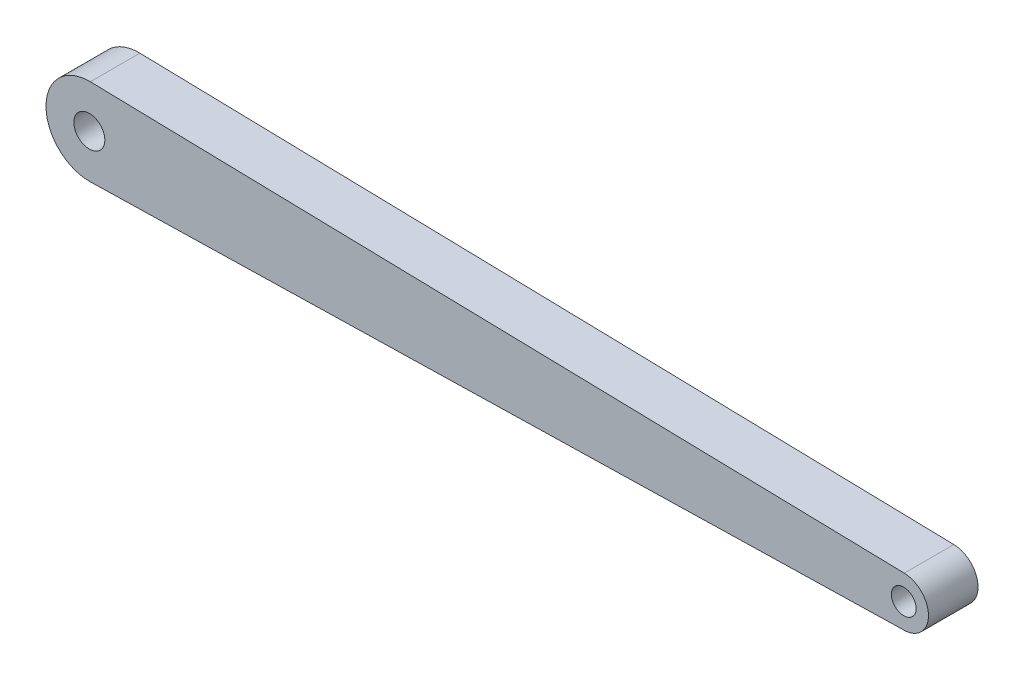
ISO-10303-21;
HEADER;
FILE_DESCRIPTION(('STEP AP214'),'2;1');
FILE_NAME('part.step','',(''),(''),'','','');
FILE_SCHEMA(('AUTOMOTIVE_DESIGN { 1 0 10303 214 1 1 1 1 }'));
ENDSEC;
DATA;
#1=APPLICATION_CONTEXT('core data for automotive mechanical design processes');
#2=APPLICATION_PROTOCOL_DEFINITION('international standard','automotive_design',2000,#1);
#3=PRODUCT_CONTEXT('',#1,'mechanical');
#4=PRODUCT('Part','Part','',(#3));
#5=PRODUCT_RELATED_PRODUCT_CATEGORY('part','',(#4));
#6=PRODUCT_DEFINITION_FORMATION('','',#4);
#7=PRODUCT_DEFINITION_CONTEXT('part definition',#1,'design');
#8=PRODUCT_DEFINITION('design','',#6,#7);
#9=PRODUCT_DEFINITION_SHAPE('','',#8);
#10=(LENGTH_UNIT() NAMED_UNIT(*) SI_UNIT(.MILLI.,.METRE.));
#11=(NAMED_UNIT(*) PLANE_ANGLE_UNIT() SI_UNIT($,.RADIAN.));
#12=(NAMED_UNIT(*) SI_UNIT($,.STERADIAN.) SOLID_ANGLE_UNIT());
#13=UNCERTAINTY_MEASURE_WITH_UNIT(LENGTH_MEASURE(1.E-05),#10,'distance_accuracy_value','');
#14=(GEOMETRIC_REPRESENTATION_CONTEXT(3) GLOBAL_UNCERTAINTY_ASSIGNED_CONTEXT((#13)) GLOBAL_UNIT_ASSIGNED_CONTEXT((#10,
#11,#12)) REPRESENTATION_CONTEXT('',''));
#15=CARTESIAN_POINT('',(0.,0.,0.));
#16=DIRECTION('',(0.,0.,1.));
#17=DIRECTION('',(1.,0.,0.));
#18=AXIS2_PLACEMENT_3D('',#15,#16,#17);
#19=CARTESIAN_POINT('',(0.,0.,40.));
#20=DIRECTION('',(0.,0.,-1.));
#21=DIRECTION('',(-1.,0.,0.));
#22=AXIS2_PLACEMENT_3D('',#19,#20,#21);
#23=PLANE('',#22);
#24=CARTESIAN_POINT('',(0.,0.,40.));
#25=DIRECTION('',(0.,0.,1.));
#26=DIRECTION('',(-1.,0.,0.));
#27=AXIS2_PLACEMENT_3D('',#24,#25,#26);
#28=CIRCLE('',#27,40.);
#29=CARTESIAN_POINT('',(0.912547528517115,-39.9895893578341,40.));
#30=VERTEX_POINT('',#29);
#31=CARTESIAN_POINT('',(0.912547528517115,39.9895893578341,40.));
#32=VERTEX_POINT('',#31);
#33=EDGE_CURVE('E96',#30,#32,#28,.T.);
#34=ORIENTED_EDGE('',*,*,#33,.T.);
#35=DIRECTION('',(-0.999739733945852,0.0228136882129278,0.));
#36=VECTOR('',#35,1.);
#37=CARTESIAN_POINT('',(-1313.40304182509,69.9817813762096,40.));
#38=LINE('',#37,#36);
#39=CARTESIAN_POINT('',(-1313.40304182509,69.9817813762096,40.));
#40=VERTEX_POINT('',#39);
#41=EDGE_CURVE('E91',#32,#40,#38,.T.);
#42=ORIENTED_EDGE('',*,*,#41,.T.);
#43=CARTESIAN_POINT('',(-1315.,0.,40.));
#44=DIRECTION('',(0.,0.,1.));
#45=DIRECTION('',(1.,0.,0.));
#46=AXIS2_PLACEMENT_3D('',#43,#44,#45);
#47=CIRCLE('',#46,70.);
#48=CARTESIAN_POINT('',(-1313.40304182509,-69.9817813762097,40.));
#49=VERTEX_POINT('',#48);
#50=EDGE_CURVE('E94',#40,#49,#47,.T.);
#51=ORIENTED_EDGE('',*,*,#50,.T.);
#52=DIRECTION('',(0.999739733945852,0.0228136882129278,0.));
#53=VECTOR('',#52,1.);
#54=CARTESIAN_POINT('',(-1313.40304182509,-69.9817813762096,40.));
#55=LINE('',#54,#53);
#56=EDGE_CURVE('E61',#49,#30,#55,.T.);
#57=ORIENTED_EDGE('',*,*,#56,.T.);
#58=EDGE_LOOP('',(#34,#42,#51,#57));
#59=FACE_BOUND('',#58,.T.);
#60=CARTESIAN_POINT('',(0.,0.,40.));
#61=DIRECTION('',(0.,0.,1.));
#62=DIRECTION('',(1.,0.,0.));
#63=AXIS2_PLACEMENT_3D('',#60,#61,#62);
#64=CIRCLE('',#63,20.);
#65=CARTESIAN_POINT('',(20.,0.,40.));
#66=VERTEX_POINT('',#65);
#67=EDGE_CURVE('E116',#66,#66,#64,.T.);
#68=ORIENTED_EDGE('',*,*,#67,.F.);
#69=EDGE_LOOP('',(#68));
#70=FACE_BOUND('',#69,.T.);
#71=CARTESIAN_POINT('',(-1315.,0.,40.));
#72=DIRECTION('',(0.,0.,1.));
#73=DIRECTION('',(1.,0.,0.));
#74=AXIS2_PLACEMENT_3D('',#71,#72,#73);
#75=CIRCLE('',#74,25.);
#76=CARTESIAN_POINT('',(-1290.,0.,40.));
#77=VERTEX_POINT('',#76);
#78=EDGE_CURVE('E138',#77,#77,#75,.T.);
#79=ORIENTED_EDGE('',*,*,#78,.F.);
#80=EDGE_LOOP('',(#79));
#81=FACE_BOUND('',#80,.T.);
#82=ADVANCED_FACE('F43',(#59,#70,#81),#23,.F.);
#83=CARTESIAN_POINT('',(0.,0.,-40.));
#84=DIRECTION('',(0.,0.,-1.));
#85=DIRECTION('',(-1.,0.,0.));
#86=AXIS2_PLACEMENT_3D('',#83,#84,#85);
#87=PLANE('',#86);
#88=CARTESIAN_POINT('',(0.,0.,-40.));
#89=DIRECTION('',(0.,0.,1.));
#90=DIRECTION('',(1.,0.,0.));
#91=AXIS2_PLACEMENT_3D('',#88,#89,#90);
#92=CIRCLE('',#91,20.);
#93=CARTESIAN_POINT('',(20.,0.,-40.));
#94=VERTEX_POINT('',#93);
#95=EDGE_CURVE('E134',#94,#94,#92,.T.);
#96=ORIENTED_EDGE('',*,*,#95,.T.);
#97=EDGE_LOOP('',(#96));
#98=FACE_BOUND('',#97,.T.);
#99=CARTESIAN_POINT('',(0.,0.,-40.));
#100=DIRECTION('',(0.,0.,1.));
#101=DIRECTION('',(-1.,0.,0.));
#102=AXIS2_PLACEMENT_3D('',#99,#100,#101);
#103=CIRCLE('',#102,40.);
#104=CARTESIAN_POINT('',(0.912547528517115,-39.9895893578341,-40.));
#105=VERTEX_POINT('',#104);
#106=CARTESIAN_POINT('',(0.912547528517115,39.9895893578341,-40.));
#107=VERTEX_POINT('',#106);
#108=EDGE_CURVE('E112',#105,#107,#103,.T.);
#109=ORIENTED_EDGE('',*,*,#108,.F.);
#110=DIRECTION('',(0.999739733945852,0.0228136882129278,0.));
#111=VECTOR('',#110,1.);
#112=CARTESIAN_POINT('',(-1313.40304182509,-69.9817813762096,-40.));
#113=LINE('',#112,#111);
#114=CARTESIAN_POINT('',(-1313.40304182509,-69.9817813762097,-40.));
#115=VERTEX_POINT('',#114);
#116=EDGE_CURVE('E84',#115,#105,#113,.T.);
#117=ORIENTED_EDGE('',*,*,#116,.F.);
#118=CARTESIAN_POINT('',(-1315.,0.,-40.));
#119=DIRECTION('',(0.,0.,1.));
#120=DIRECTION('',(1.,0.,0.));
#121=AXIS2_PLACEMENT_3D('',#118,#119,#120);
#122=CIRCLE('',#121,70.);
#123=CARTESIAN_POINT('',(-1313.40304182509,69.9817813762096,-40.));
#124=VERTEX_POINT('',#123);
#125=EDGE_CURVE('E78',#124,#115,#122,.T.);
#126=ORIENTED_EDGE('',*,*,#125,.F.);
#127=DIRECTION('',(-0.999739733945852,0.0228136882129278,0.));
#128=VECTOR('',#127,1.);
#129=CARTESIAN_POINT('',(-1313.40304182509,69.9817813762096,-40.));
#130=LINE('',#129,#128);
#131=EDGE_CURVE('E101',#107,#124,#130,.T.);
#132=ORIENTED_EDGE('',*,*,#131,.F.);
#133=EDGE_LOOP('',(#109,#117,#126,#132));
#134=FACE_BOUND('',#133,.T.);
#135=CARTESIAN_POINT('',(-1315.,0.,-40.));
#136=DIRECTION('',(0.,0.,1.));
#137=DIRECTION('',(1.,0.,0.));
#138=AXIS2_PLACEMENT_3D('',#135,#136,#137);
#139=CIRCLE('',#138,25.);
#140=CARTESIAN_POINT('',(-1290.,0.,-40.));
#141=VERTEX_POINT('',#140);
#142=EDGE_CURVE('E142',#141,#141,#139,.T.);
#143=ORIENTED_EDGE('',*,*,#142,.T.);
#144=EDGE_LOOP('',(#143));
#145=FACE_BOUND('',#144,.T.);
#146=ADVANCED_FACE('F129',(#98,#134,#145),#87,.T.);
#147=CARTESIAN_POINT('',(0.,0.,40.));
#148=DIRECTION('',(0.,0.,-1.));
#149=DIRECTION('',(-1.,0.,0.));
#150=AXIS2_PLACEMENT_3D('',#147,#148,#149);
#151=CYLINDRICAL_SURFACE('',#150,40.);
#152=ORIENTED_EDGE('',*,*,#108,.T.);
#153=DIRECTION('',(0.,0.,-1.));
#154=VECTOR('',#153,1.);
#155=CARTESIAN_POINT('',(0.912547528517115,39.9895893578341,40.));
#156=LINE('',#155,#154);
#157=EDGE_CURVE('E11',#32,#107,#156,.T.);
#158=ORIENTED_EDGE('',*,*,#157,.F.);
#159=ORIENTED_EDGE('',*,*,#33,.F.);
#160=DIRECTION('',(0.,0.,-1.));
#161=VECTOR('',#160,1.);
#162=CARTESIAN_POINT('',(0.912547528517115,-39.9895893578341,40.));
#163=LINE('',#162,#161);
#164=EDGE_CURVE('E108',#30,#105,#163,.T.);
#165=ORIENTED_EDGE('',*,*,#164,.T.);
#166=EDGE_LOOP('',(#152,#158,#159,#165));
#167=FACE_BOUND('',#166,.T.);
#168=ADVANCED_FACE('F45',(#167),#151,.T.);
#169=CARTESIAN_POINT('',(-1313.40304182509,69.9817813762096,40.));
#170=DIRECTION('',(-0.0228136882129278,-0.999739733945852,0.));
#171=DIRECTION('',(0.999739733945852,-0.0228136882129278,0.));
#172=AXIS2_PLACEMENT_3D('',#169,#170,#171);
#173=PLANE('',#172);
#174=ORIENTED_EDGE('',*,*,#131,.T.);
#175=DIRECTION('',(0.,0.,-1.));
#176=VECTOR('',#175,1.);
#177=CARTESIAN_POINT('',(-1313.40304182509,69.9817813762096,40.));
#178=LINE('',#177,#176);
#179=EDGE_CURVE('E53',#40,#124,#178,.T.);
#180=ORIENTED_EDGE('',*,*,#179,.F.);
#181=ORIENTED_EDGE('',*,*,#41,.F.);
#182=ORIENTED_EDGE('',*,*,#157,.T.);
#183=EDGE_LOOP('',(#174,#180,#181,#182));
#184=FACE_BOUND('',#183,.T.);
#185=ADVANCED_FACE('F100',(#184),#173,.F.);
#186=CARTESIAN_POINT('',(-1315.,0.,40.));
#187=DIRECTION('',(0.,0.,-1.));
#188=DIRECTION('',(-1.,0.,0.));
#189=AXIS2_PLACEMENT_3D('',#186,#187,#188);
#190=CYLINDRICAL_SURFACE('',#189,70.);
#191=ORIENTED_EDGE('',*,*,#125,.T.);
#192=DIRECTION('',(0.,0.,-1.));
#193=VECTOR('',#192,1.);
#194=CARTESIAN_POINT('',(-1313.40304182509,-69.9817813762097,40.));
#195=LINE('',#194,#193);
#196=EDGE_CURVE('E103',#49,#115,#195,.T.);
#197=ORIENTED_EDGE('',*,*,#196,.F.);
#198=ORIENTED_EDGE('',*,*,#50,.F.);
#199=ORIENTED_EDGE('',*,*,#179,.T.);
#200=EDGE_LOOP('',(#191,#197,#198,#199));
#201=FACE_BOUND('',#200,.T.);
#202=ADVANCED_FACE('F104',(#201),#190,.T.);
#203=CARTESIAN_POINT('',(-1313.40304182509,-69.9817813762096,40.));
#204=DIRECTION('',(-0.0228136882129278,0.999739733945852,0.));
#205=DIRECTION('',(-0.999739733945852,-0.0228136882129278,0.));
#206=AXIS2_PLACEMENT_3D('',#203,#204,#205);
#207=PLANE('',#206);
#208=ORIENTED_EDGE('',*,*,#116,.T.);
#209=ORIENTED_EDGE('',*,*,#164,.F.);
#210=ORIENTED_EDGE('',*,*,#56,.F.);
#211=ORIENTED_EDGE('',*,*,#196,.T.);
#212=EDGE_LOOP('',(#208,#209,#210,#211));
#213=FACE_BOUND('',#212,.T.);
#214=ADVANCED_FACE('F126',(#213),#207,.F.);
#215=CARTESIAN_POINT('',(0.,0.,40.));
#216=DIRECTION('',(0.,0.,-1.));
#217=DIRECTION('',(-1.,0.,0.));
#218=AXIS2_PLACEMENT_3D('',#215,#216,#217);
#219=CYLINDRICAL_SURFACE('',#218,20.);
#220=ORIENTED_EDGE('',*,*,#67,.T.);
#221=EDGE_LOOP('',(#220));
#222=FACE_BOUND('',#221,.T.);
#223=ORIENTED_EDGE('',*,*,#95,.F.);
#224=EDGE_LOOP('',(#223));
#225=FACE_BOUND('',#224,.T.);
#226=ADVANCED_FACE('F161',(#222,#225),#219,.F.);
#227=CARTESIAN_POINT('',(-1315.,0.,40.));
#228=DIRECTION('',(0.,0.,-1.));
#229=DIRECTION('',(-1.,0.,0.));
#230=AXIS2_PLACEMENT_3D('',#227,#228,#229);
#231=CYLINDRICAL_SURFACE('',#230,25.);
#232=ORIENTED_EDGE('',*,*,#78,.T.);
#233=EDGE_LOOP('',(#232));
#234=FACE_BOUND('',#233,.T.);
#235=ORIENTED_EDGE('',*,*,#142,.F.);
#236=EDGE_LOOP('',(#235));
#237=FACE_BOUND('',#236,.T.);
#238=ADVANCED_FACE('F150',(#234,#237),#231,.F.);
#239=CLOSED_SHELL('',(#82,#146,#168,#185,#202,#214,#226,#238));
#240=MANIFOLD_SOLID_BREP('B2',#239);
#241=ADVANCED_BREP_SHAPE_REPRESENTATION('',(#18,#240),#14);
#242=SHAPE_DEFINITION_REPRESENTATION(#9,#241);
ENDSEC;
END-ISO-10303-21;
